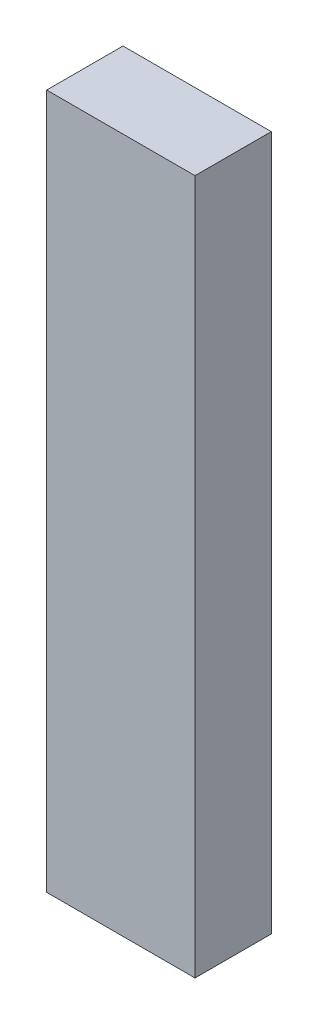
ISO-10303-21;
HEADER;
FILE_DESCRIPTION(('STEP AP214'),'2;1');
FILE_NAME('part.step','',(''),(''),'','','');
FILE_SCHEMA(('AUTOMOTIVE_DESIGN { 1 0 10303 214 1 1 1 1 }'));
ENDSEC;
DATA;
#1=APPLICATION_CONTEXT('core data for automotive mechanical design processes');
#2=APPLICATION_PROTOCOL_DEFINITION('international standard','automotive_design',2000,#1);
#3=PRODUCT_CONTEXT('',#1,'mechanical');
#4=PRODUCT('Part','Part','',(#3));
#5=PRODUCT_RELATED_PRODUCT_CATEGORY('part','',(#4));
#6=PRODUCT_DEFINITION_FORMATION('','',#4);
#7=PRODUCT_DEFINITION_CONTEXT('part definition',#1,'design');
#8=PRODUCT_DEFINITION('design','',#6,#7);
#9=PRODUCT_DEFINITION_SHAPE('','',#8);
#10=(LENGTH_UNIT() NAMED_UNIT(*) SI_UNIT(.MILLI.,.METRE.));
#11=(NAMED_UNIT(*) PLANE_ANGLE_UNIT() SI_UNIT($,.RADIAN.));
#12=(NAMED_UNIT(*) SI_UNIT($,.STERADIAN.) SOLID_ANGLE_UNIT());
#13=UNCERTAINTY_MEASURE_WITH_UNIT(LENGTH_MEASURE(1.E-05),#10,'distance_accuracy_value','');
#14=(GEOMETRIC_REPRESENTATION_CONTEXT(3) GLOBAL_UNCERTAINTY_ASSIGNED_CONTEXT((#13)) GLOBAL_UNIT_ASSIGNED_CONTEXT((#10,
#11,#12)) REPRESENTATION_CONTEXT('',''));
#15=CARTESIAN_POINT('',(0.,0.,0.));
#16=DIRECTION('',(0.,0.,1.));
#17=DIRECTION('',(1.,0.,0.));
#18=AXIS2_PLACEMENT_3D('',#15,#16,#17);
#19=CARTESIAN_POINT('',(17.5,82.,18.));
#20=DIRECTION('',(-1.,0.,0.));
#21=DIRECTION('',(0.,-1.,0.));
#22=AXIS2_PLACEMENT_3D('',#19,#20,#21);
#23=PLANE('',#22);
#24=DIRECTION('',(0.,1.,0.));
#25=VECTOR('',#24,1.);
#26=CARTESIAN_POINT('',(17.5,82.,0.));
#27=LINE('',#26,#25);
#28=CARTESIAN_POINT('',(17.5,-82.,0.));
#29=VERTEX_POINT('',#28);
#30=CARTESIAN_POINT('',(17.5,82.,0.));
#31=VERTEX_POINT('',#30);
#32=EDGE_CURVE('E96',#29,#31,#27,.T.);
#33=ORIENTED_EDGE('',*,*,#32,.T.);
#34=DIRECTION('',(0.,0.,-1.));
#35=VECTOR('',#34,1.);
#36=CARTESIAN_POINT('',(17.5,82.,18.));
#37=LINE('',#36,#35);
#38=CARTESIAN_POINT('',(17.5,82.,18.));
#39=VERTEX_POINT('',#38);
#40=EDGE_CURVE('E11',#39,#31,#37,.T.);
#41=ORIENTED_EDGE('',*,*,#40,.F.);
#42=DIRECTION('',(0.,1.,0.));
#43=VECTOR('',#42,1.);
#44=CARTESIAN_POINT('',(17.5,82.,18.));
#45=LINE('',#44,#43);
#46=CARTESIAN_POINT('',(17.5,-82.,18.));
#47=VERTEX_POINT('',#46);
#48=EDGE_CURVE('E84',#47,#39,#45,.T.);
#49=ORIENTED_EDGE('',*,*,#48,.F.);
#50=DIRECTION('',(0.,0.,-1.));
#51=VECTOR('',#50,1.);
#52=CARTESIAN_POINT('',(17.5,-82.,18.));
#53=LINE('',#52,#51);
#54=EDGE_CURVE('E92',#47,#29,#53,.T.);
#55=ORIENTED_EDGE('',*,*,#54,.T.);
#56=EDGE_LOOP('',(#33,#41,#49,#55));
#57=FACE_BOUND('',#56,.T.);
#58=ADVANCED_FACE('F33',(#57),#23,.F.);
#59=CARTESIAN_POINT('',(-17.5,82.,18.));
#60=DIRECTION('',(0.,-1.,0.));
#61=DIRECTION('',(0.,0.,-1.));
#62=AXIS2_PLACEMENT_3D('',#59,#60,#61);
#63=PLANE('',#62);
#64=DIRECTION('',(-1.,0.,0.));
#65=VECTOR('',#64,1.);
#66=CARTESIAN_POINT('',(-17.5,82.,0.));
#67=LINE('',#66,#65);
#68=CARTESIAN_POINT('',(-17.5,82.,0.));
#69=VERTEX_POINT('',#68);
#70=EDGE_CURVE('E88',#31,#69,#67,.T.);
#71=ORIENTED_EDGE('',*,*,#70,.T.);
#72=DIRECTION('',(0.,0.,-1.));
#73=VECTOR('',#72,1.);
#74=CARTESIAN_POINT('',(-17.5,82.,18.));
#75=LINE('',#74,#73);
#76=CARTESIAN_POINT('',(-17.5,82.,18.));
#77=VERTEX_POINT('',#76);
#78=EDGE_CURVE('E41',#77,#69,#75,.T.);
#79=ORIENTED_EDGE('',*,*,#78,.F.);
#80=DIRECTION('',(-1.,0.,0.));
#81=VECTOR('',#80,1.);
#82=CARTESIAN_POINT('',(-17.5,82.,18.));
#83=LINE('',#82,#81);
#84=EDGE_CURVE('E79',#39,#77,#83,.T.);
#85=ORIENTED_EDGE('',*,*,#84,.F.);
#86=ORIENTED_EDGE('',*,*,#40,.T.);
#87=EDGE_LOOP('',(#71,#79,#85,#86));
#88=FACE_BOUND('',#87,.T.);
#89=ADVANCED_FACE('F87',(#88),#63,.F.);
#90=CARTESIAN_POINT('',(-17.5,82.,18.));
#91=DIRECTION('',(1.,0.,0.));
#92=DIRECTION('',(0.,1.,0.));
#93=AXIS2_PLACEMENT_3D('',#90,#91,#92);
#94=PLANE('',#93);
#95=DIRECTION('',(0.,-1.,0.));
#96=VECTOR('',#95,1.);
#97=CARTESIAN_POINT('',(-17.5,82.,0.));
#98=LINE('',#97,#96);
#99=CARTESIAN_POINT('',(-17.5,-82.,0.));
#100=VERTEX_POINT('',#99);
#101=EDGE_CURVE('E66',#69,#100,#98,.T.);
#102=ORIENTED_EDGE('',*,*,#101,.T.);
#103=DIRECTION('',(0.,0.,-1.));
#104=VECTOR('',#103,1.);
#105=CARTESIAN_POINT('',(-17.5,-82.,18.));
#106=LINE('',#105,#104);
#107=CARTESIAN_POINT('',(-17.5,-82.,18.));
#108=VERTEX_POINT('',#107);
#109=EDGE_CURVE('E89',#108,#100,#106,.T.);
#110=ORIENTED_EDGE('',*,*,#109,.F.);
#111=DIRECTION('',(0.,-1.,0.));
#112=VECTOR('',#111,1.);
#113=CARTESIAN_POINT('',(-17.5,82.,18.));
#114=LINE('',#113,#112);
#115=EDGE_CURVE('E82',#77,#108,#114,.T.);
#116=ORIENTED_EDGE('',*,*,#115,.F.);
#117=ORIENTED_EDGE('',*,*,#78,.T.);
#118=EDGE_LOOP('',(#102,#110,#116,#117));
#119=FACE_BOUND('',#118,.T.);
#120=ADVANCED_FACE('F90',(#119),#94,.F.);
#121=CARTESIAN_POINT('',(-17.5,-82.,18.));
#122=DIRECTION('',(0.,1.,0.));
#123=DIRECTION('',(0.,0.,1.));
#124=AXIS2_PLACEMENT_3D('',#121,#122,#123);
#125=PLANE('',#124);
#126=DIRECTION('',(1.,0.,0.));
#127=VECTOR('',#126,1.);
#128=CARTESIAN_POINT('',(-17.5,-82.,0.));
#129=LINE('',#128,#127);
#130=EDGE_CURVE('E72',#100,#29,#129,.T.);
#131=ORIENTED_EDGE('',*,*,#130,.T.);
#132=ORIENTED_EDGE('',*,*,#54,.F.);
#133=DIRECTION('',(1.,0.,0.));
#134=VECTOR('',#133,1.);
#135=CARTESIAN_POINT('',(-17.5,-82.,18.));
#136=LINE('',#135,#134);
#137=EDGE_CURVE('E49',#108,#47,#136,.T.);
#138=ORIENTED_EDGE('',*,*,#137,.F.);
#139=ORIENTED_EDGE('',*,*,#109,.T.);
#140=EDGE_LOOP('',(#131,#132,#138,#139));
#141=FACE_BOUND('',#140,.T.);
#142=ADVANCED_FACE('F103',(#141),#125,.F.);
#143=CARTESIAN_POINT('',(0.,0.,18.));
#144=DIRECTION('',(0.,0.,1.));
#145=DIRECTION('',(1.,0.,0.));
#146=AXIS2_PLACEMENT_3D('',#143,#144,#145);
#147=PLANE('',#146);
#148=ORIENTED_EDGE('',*,*,#48,.T.);
#149=ORIENTED_EDGE('',*,*,#84,.T.);
#150=ORIENTED_EDGE('',*,*,#115,.T.);
#151=ORIENTED_EDGE('',*,*,#137,.T.);
#152=EDGE_LOOP('',(#148,#149,#150,#151));
#153=FACE_BOUND('',#152,.T.);
#154=ADVANCED_FACE('F80',(#153),#147,.T.);
#155=CARTESIAN_POINT('',(0.,0.,0.));
#156=DIRECTION('',(0.,0.,1.));
#157=DIRECTION('',(1.,0.,0.));
#158=AXIS2_PLACEMENT_3D('',#155,#156,#157);
#159=PLANE('',#158);
#160=ORIENTED_EDGE('',*,*,#32,.F.);
#161=ORIENTED_EDGE('',*,*,#130,.F.);
#162=ORIENTED_EDGE('',*,*,#101,.F.);
#163=ORIENTED_EDGE('',*,*,#70,.F.);
#164=EDGE_LOOP('',(#160,#161,#162,#163));
#165=FACE_BOUND('',#164,.T.);
#166=ADVANCED_FACE('F106',(#165),#159,.F.);
#167=CLOSED_SHELL('',(#58,#89,#120,#142,#154,#166));
#168=MANIFOLD_SOLID_BREP('B2',#167);
#169=ADVANCED_BREP_SHAPE_REPRESENTATION('',(#18,#168),#14);
#170=SHAPE_DEFINITION_REPRESENTATION(#9,#169);
ENDSEC;
END-ISO-10303-21;
